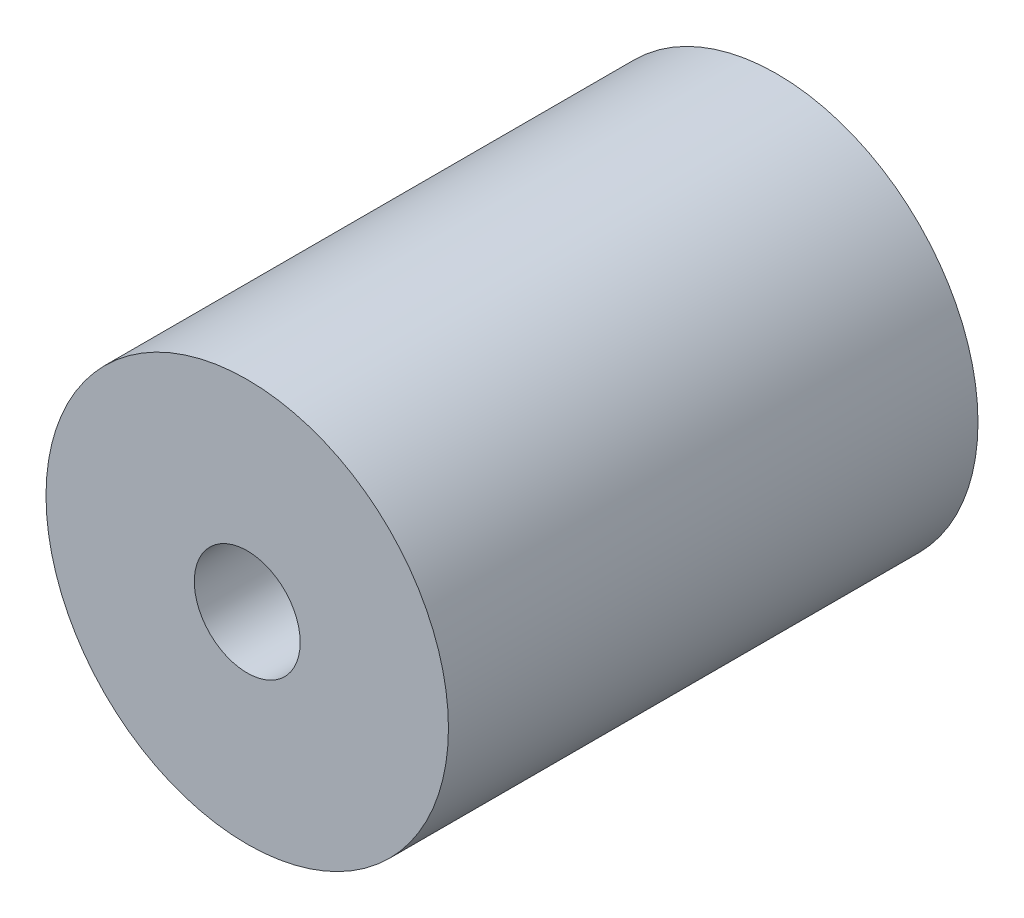
ISO-10303-21;
HEADER;
FILE_DESCRIPTION(('STEP AP214'),'2;1');
FILE_NAME('part.step','',(''),(''),'','','');
FILE_SCHEMA(('AUTOMOTIVE_DESIGN { 1 0 10303 214 1 1 1 1 }'));
ENDSEC;
DATA;
#1=APPLICATION_CONTEXT('core data for automotive mechanical design processes');
#2=APPLICATION_PROTOCOL_DEFINITION('international standard','automotive_design',2000,#1);
#3=PRODUCT_CONTEXT('',#1,'mechanical');
#4=PRODUCT('Part','Part','',(#3));
#5=PRODUCT_RELATED_PRODUCT_CATEGORY('part','',(#4));
#6=PRODUCT_DEFINITION_FORMATION('','',#4);
#7=PRODUCT_DEFINITION_CONTEXT('part definition',#1,'design');
#8=PRODUCT_DEFINITION('design','',#6,#7);
#9=PRODUCT_DEFINITION_SHAPE('','',#8);
#10=(LENGTH_UNIT() NAMED_UNIT(*) SI_UNIT(.MILLI.,.METRE.));
#11=(NAMED_UNIT(*) PLANE_ANGLE_UNIT() SI_UNIT($,.RADIAN.));
#12=(NAMED_UNIT(*) SI_UNIT($,.STERADIAN.) SOLID_ANGLE_UNIT());
#13=UNCERTAINTY_MEASURE_WITH_UNIT(LENGTH_MEASURE(1.E-05),#10,'distance_accuracy_value','');
#14=(GEOMETRIC_REPRESENTATION_CONTEXT(3) GLOBAL_UNCERTAINTY_ASSIGNED_CONTEXT((#13)) GLOBAL_UNIT_ASSIGNED_CONTEXT((#10,
#11,#12)) REPRESENTATION_CONTEXT('',''));
#15=CARTESIAN_POINT('',(0.,0.,0.));
#16=DIRECTION('',(0.,0.,1.));
#17=DIRECTION('',(1.,0.,0.));
#18=AXIS2_PLACEMENT_3D('',#15,#16,#17);
#19=CARTESIAN_POINT('',(0.,0.,-17.5));
#20=DIRECTION('',(0.,0.,1.));
#21=DIRECTION('',(1.,0.,0.));
#22=AXIS2_PLACEMENT_3D('',#19,#20,#21);
#23=CYLINDRICAL_SURFACE('',#22,4.);
#24=CARTESIAN_POINT('',(0.,0.,-17.5));
#25=DIRECTION('',(0.,0.,1.));
#26=DIRECTION('',(1.,0.,0.));
#27=AXIS2_PLACEMENT_3D('',#24,#25,#26);
#28=CIRCLE('',#27,4.);
#29=CARTESIAN_POINT('',(4.,0.,-17.5));
#30=VERTEX_POINT('',#29);
#31=EDGE_CURVE('E39',#30,#30,#28,.T.);
#32=ORIENTED_EDGE('',*,*,#31,.F.);
#33=EDGE_LOOP('',(#32));
#34=FACE_BOUND('',#33,.T.);
#35=CARTESIAN_POINT('',(0.,0.,0.));
#36=DIRECTION('',(0.,0.,1.));
#37=DIRECTION('',(1.,0.,0.));
#38=AXIS2_PLACEMENT_3D('',#35,#36,#37);
#39=CIRCLE('',#38,4.);
#40=CARTESIAN_POINT('',(4.,0.,0.));
#41=VERTEX_POINT('',#40);
#42=EDGE_CURVE('E35',#41,#41,#39,.T.);
#43=ORIENTED_EDGE('',*,*,#42,.T.);
#44=EDGE_LOOP('',(#43));
#45=FACE_BOUND('',#44,.T.);
#46=ADVANCED_FACE('F32',(#34,#45),#23,.F.);
#47=CARTESIAN_POINT('',(0.,0.,-17.5));
#48=DIRECTION('',(0.,0.,1.));
#49=DIRECTION('',(1.,0.,0.));
#50=AXIS2_PLACEMENT_3D('',#47,#48,#49);
#51=CYLINDRICAL_SURFACE('',#50,9.5);
#52=CARTESIAN_POINT('',(0.,0.,-17.5));
#53=DIRECTION('',(0.,0.,1.));
#54=DIRECTION('',(1.,0.,0.));
#55=AXIS2_PLACEMENT_3D('',#52,#53,#54);
#56=CIRCLE('',#55,9.5);
#57=CARTESIAN_POINT('',(9.5,0.,-17.5));
#58=VERTEX_POINT('',#57);
#59=EDGE_CURVE('E10',#58,#58,#56,.T.);
#60=ORIENTED_EDGE('',*,*,#59,.T.);
#61=EDGE_LOOP('',(#60));
#62=FACE_BOUND('',#61,.T.);
#63=CARTESIAN_POINT('',(0.,0.,7.5));
#64=DIRECTION('',(0.,0.,1.));
#65=DIRECTION('',(1.,0.,0.));
#66=AXIS2_PLACEMENT_3D('',#63,#64,#65);
#67=CIRCLE('',#66,9.5);
#68=CARTESIAN_POINT('',(9.5,0.,7.5));
#69=VERTEX_POINT('',#68);
#70=EDGE_CURVE('E49',#69,#69,#67,.T.);
#71=ORIENTED_EDGE('',*,*,#70,.F.);
#72=EDGE_LOOP('',(#71));
#73=FACE_BOUND('',#72,.T.);
#74=ADVANCED_FACE('F64',(#62,#73),#51,.T.);
#75=CARTESIAN_POINT('',(0.,0.,-17.5));
#76=DIRECTION('',(0.,0.,1.));
#77=DIRECTION('',(1.,0.,0.));
#78=AXIS2_PLACEMENT_3D('',#75,#76,#77);
#79=PLANE('',#78);
#80=ORIENTED_EDGE('',*,*,#31,.T.);
#81=EDGE_LOOP('',(#80));
#82=FACE_BOUND('',#81,.T.);
#83=ORIENTED_EDGE('',*,*,#59,.F.);
#84=EDGE_LOOP('',(#83));
#85=FACE_BOUND('',#84,.T.);
#86=ADVANCED_FACE('F66',(#82,#85),#79,.F.);
#87=CARTESIAN_POINT('',(0.,0.,0.));
#88=DIRECTION('',(0.,0.,1.));
#89=DIRECTION('',(1.,0.,0.));
#90=AXIS2_PLACEMENT_3D('',#87,#88,#89);
#91=PLANE('',#90);
#92=CARTESIAN_POINT('',(0.,0.,0.));
#93=DIRECTION('',(0.,0.,1.));
#94=DIRECTION('',(1.,0.,0.));
#95=AXIS2_PLACEMENT_3D('',#92,#93,#94);
#96=CIRCLE('',#95,2.5);
#97=CARTESIAN_POINT('',(2.5,0.,0.));
#98=VERTEX_POINT('',#97);
#99=EDGE_CURVE('E45',#98,#98,#96,.T.);
#100=ORIENTED_EDGE('',*,*,#99,.T.);
#101=EDGE_LOOP('',(#100));
#102=FACE_BOUND('',#101,.T.);
#103=ORIENTED_EDGE('',*,*,#42,.F.);
#104=EDGE_LOOP('',(#103));
#105=FACE_BOUND('',#104,.T.);
#106=ADVANCED_FACE('F71',(#102,#105),#91,.F.);
#107=CARTESIAN_POINT('',(0.,0.,7.5));
#108=DIRECTION('',(0.,0.,-1.));
#109=DIRECTION('',(-1.,0.,0.));
#110=AXIS2_PLACEMENT_3D('',#107,#108,#109);
#111=CYLINDRICAL_SURFACE('',#110,2.5);
#112=CARTESIAN_POINT('',(0.,0.,7.5));
#113=DIRECTION('',(0.,0.,1.));
#114=DIRECTION('',(1.,0.,0.));
#115=AXIS2_PLACEMENT_3D('',#112,#113,#114);
#116=CIRCLE('',#115,2.5);
#117=CARTESIAN_POINT('',(2.5,0.,7.5));
#118=VERTEX_POINT('',#117);
#119=EDGE_CURVE('E48',#118,#118,#116,.T.);
#120=ORIENTED_EDGE('',*,*,#119,.T.);
#121=EDGE_LOOP('',(#120));
#122=FACE_BOUND('',#121,.T.);
#123=ORIENTED_EDGE('',*,*,#99,.F.);
#124=EDGE_LOOP('',(#123));
#125=FACE_BOUND('',#124,.T.);
#126=ADVANCED_FACE('F55',(#122,#125),#111,.F.);
#127=CARTESIAN_POINT('',(0.,0.,7.5));
#128=DIRECTION('',(0.,0.,1.));
#129=DIRECTION('',(1.,0.,0.));
#130=AXIS2_PLACEMENT_3D('',#127,#128,#129);
#131=PLANE('',#130);
#132=ORIENTED_EDGE('',*,*,#119,.F.);
#133=EDGE_LOOP('',(#132));
#134=FACE_BOUND('',#133,.T.);
#135=ORIENTED_EDGE('',*,*,#70,.T.);
#136=EDGE_LOOP('',(#135));
#137=FACE_BOUND('',#136,.T.);
#138=ADVANCED_FACE('F58',(#134,#137),#131,.T.);
#139=CLOSED_SHELL('',(#46,#74,#86,#106,#126,#138));
#140=MANIFOLD_SOLID_BREP('B2',#139);
#141=ADVANCED_BREP_SHAPE_REPRESENTATION('',(#18,#140),#14);
#142=SHAPE_DEFINITION_REPRESENTATION(#9,#141);
ENDSEC;
END-ISO-10303-21;
